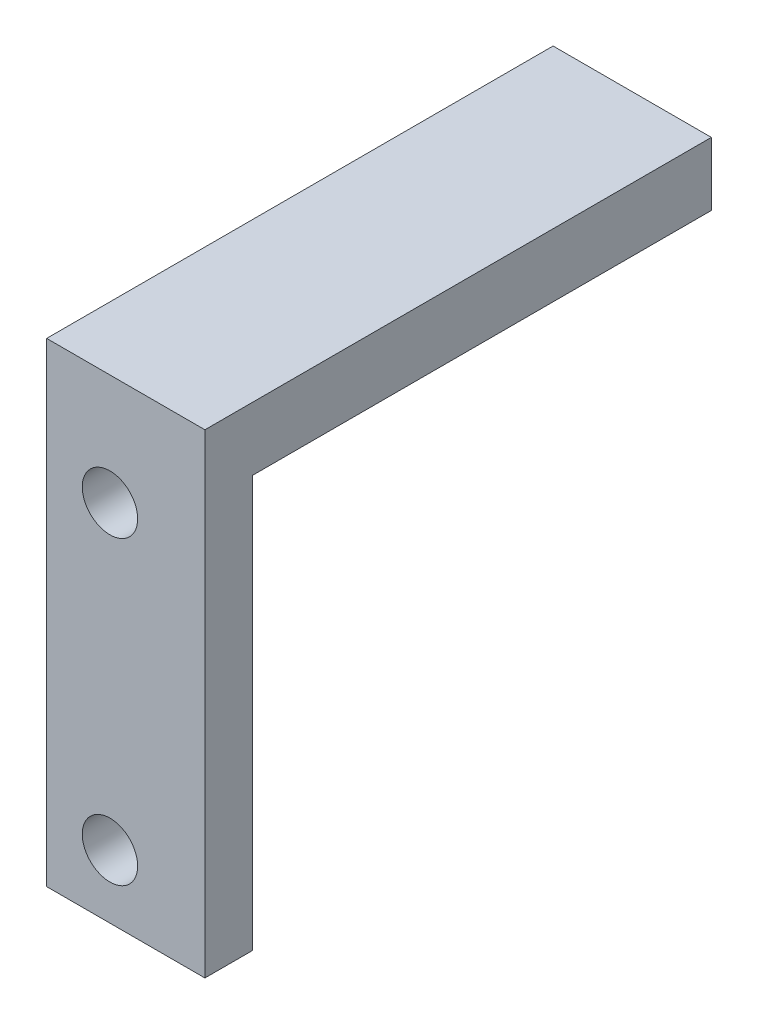
ISO-10303-21;
HEADER;
FILE_DESCRIPTION(('STEP AP214'),'2;1');
FILE_NAME('part.step','',(''),(''),'','','');
FILE_SCHEMA(('AUTOMOTIVE_DESIGN { 1 0 10303 214 1 1 1 1 }'));
ENDSEC;
DATA;
#1=APPLICATION_CONTEXT('core data for automotive mechanical design processes');
#2=APPLICATION_PROTOCOL_DEFINITION('international standard','automotive_design',2000,#1);
#3=PRODUCT_CONTEXT('',#1,'mechanical');
#4=PRODUCT('Part','Part','',(#3));
#5=PRODUCT_RELATED_PRODUCT_CATEGORY('part','',(#4));
#6=PRODUCT_DEFINITION_FORMATION('','',#4);
#7=PRODUCT_DEFINITION_CONTEXT('part definition',#1,'design');
#8=PRODUCT_DEFINITION('design','',#6,#7);
#9=PRODUCT_DEFINITION_SHAPE('','',#8);
#10=(LENGTH_UNIT() NAMED_UNIT(*) SI_UNIT(.MILLI.,.METRE.));
#11=(NAMED_UNIT(*) PLANE_ANGLE_UNIT() SI_UNIT($,.RADIAN.));
#12=(NAMED_UNIT(*) SI_UNIT($,.STERADIAN.) SOLID_ANGLE_UNIT());
#13=UNCERTAINTY_MEASURE_WITH_UNIT(LENGTH_MEASURE(1.E-05),#10,'distance_accuracy_value','');
#14=(GEOMETRIC_REPRESENTATION_CONTEXT(3) GLOBAL_UNCERTAINTY_ASSIGNED_CONTEXT((#13)) GLOBAL_UNIT_ASSIGNED_CONTEXT((#10,
#11,#12)) REPRESENTATION_CONTEXT('',''));
#15=CARTESIAN_POINT('',(0.,0.,0.));
#16=DIRECTION('',(0.,0.,1.));
#17=DIRECTION('',(1.,0.,0.));
#18=AXIS2_PLACEMENT_3D('',#15,#16,#17);
#19=CARTESIAN_POINT('',(0.,0.,32.));
#20=DIRECTION('',(0.,0.,1.));
#21=DIRECTION('',(1.,0.,0.));
#22=AXIS2_PLACEMENT_3D('',#19,#20,#21);
#23=PLANE('',#22);
#24=CARTESIAN_POINT('',(4.,-7.,32.));
#25=DIRECTION('',(0.,0.,1.));
#26=DIRECTION('',(1.,0.,0.));
#27=AXIS2_PLACEMENT_3D('',#24,#25,#26);
#28=CIRCLE('',#27,1.75);
#29=CARTESIAN_POINT('',(5.75,-7.,32.));
#30=VERTEX_POINT('',#29);
#31=EDGE_CURVE('E162',#30,#30,#28,.T.);
#32=ORIENTED_EDGE('',*,*,#31,.F.);
#33=EDGE_LOOP('',(#32));
#34=FACE_BOUND('',#33,.T.);
#35=DIRECTION('',(0.,-1.,0.));
#36=VECTOR('',#35,1.);
#37=CARTESIAN_POINT('',(0.,0.,32.));
#38=LINE('',#37,#36);
#39=CARTESIAN_POINT('',(0.,0.,32.));
#40=VERTEX_POINT('',#39);
#41=CARTESIAN_POINT('',(0.,-30.,32.));
#42=VERTEX_POINT('',#41);
#43=EDGE_CURVE('E175',#40,#42,#38,.T.);
#44=ORIENTED_EDGE('',*,*,#43,.T.);
#45=DIRECTION('',(1.,0.,0.));
#46=VECTOR('',#45,1.);
#47=CARTESIAN_POINT('',(0.,-30.,32.));
#48=LINE('',#47,#46);
#49=CARTESIAN_POINT('',(10.,-30.,32.));
#50=VERTEX_POINT('',#49);
#51=EDGE_CURVE('E89',#42,#50,#48,.T.);
#52=ORIENTED_EDGE('',*,*,#51,.T.);
#53=DIRECTION('',(0.,1.,0.));
#54=VECTOR('',#53,1.);
#55=CARTESIAN_POINT('',(10.,0.,32.));
#56=LINE('',#55,#54);
#57=CARTESIAN_POINT('',(10.,0.,32.));
#58=VERTEX_POINT('',#57);
#59=EDGE_CURVE('E180',#50,#58,#56,.T.);
#60=ORIENTED_EDGE('',*,*,#59,.T.);
#61=DIRECTION('',(-1.,0.,0.));
#62=VECTOR('',#61,1.);
#63=CARTESIAN_POINT('',(0.,0.,32.));
#64=LINE('',#63,#62);
#65=EDGE_CURVE('E67',#58,#40,#64,.T.);
#66=ORIENTED_EDGE('',*,*,#65,.T.);
#67=EDGE_LOOP('',(#44,#52,#60,#66));
#68=FACE_BOUND('',#67,.T.);
#69=CARTESIAN_POINT('',(4.,-26.,32.));
#70=DIRECTION('',(0.,0.,1.));
#71=DIRECTION('',(1.,0.,0.));
#72=AXIS2_PLACEMENT_3D('',#69,#70,#71);
#73=CIRCLE('',#72,1.75);
#74=CARTESIAN_POINT('',(5.75000000000001,-26.,32.));
#75=VERTEX_POINT('',#74);
#76=EDGE_CURVE('E165',#75,#75,#73,.T.);
#77=ORIENTED_EDGE('',*,*,#76,.F.);
#78=EDGE_LOOP('',(#77));
#79=FACE_BOUND('',#78,.T.);
#80=ADVANCED_FACE('F41',(#34,#68,#79),#23,.T.);
#81=CARTESIAN_POINT('',(0.,0.,0.));
#82=DIRECTION('',(0.,0.,1.));
#83=DIRECTION('',(1.,0.,0.));
#84=AXIS2_PLACEMENT_3D('',#81,#82,#83);
#85=PLANE('',#84);
#86=DIRECTION('',(0.,1.,0.));
#87=VECTOR('',#86,1.);
#88=CARTESIAN_POINT('',(10.,0.,0.));
#89=LINE('',#88,#87);
#90=CARTESIAN_POINT('',(10.,-4.,0.));
#91=VERTEX_POINT('',#90);
#92=CARTESIAN_POINT('',(10.,0.,0.));
#93=VERTEX_POINT('',#92);
#94=EDGE_CURVE('E169',#91,#93,#89,.T.);
#95=ORIENTED_EDGE('',*,*,#94,.F.);
#96=DIRECTION('',(1.,0.,0.));
#97=VECTOR('',#96,1.);
#98=CARTESIAN_POINT('',(10.,-4.,0.));
#99=LINE('',#98,#97);
#100=CARTESIAN_POINT('',(0.,-4.,0.));
#101=VERTEX_POINT('',#100);
#102=EDGE_CURVE('E58',#101,#91,#99,.T.);
#103=ORIENTED_EDGE('',*,*,#102,.F.);
#104=DIRECTION('',(0.,-1.,0.));
#105=VECTOR('',#104,1.);
#106=CARTESIAN_POINT('',(0.,0.,0.));
#107=LINE('',#106,#105);
#108=CARTESIAN_POINT('',(0.,0.,0.));
#109=VERTEX_POINT('',#108);
#110=EDGE_CURVE('E164',#109,#101,#107,.T.);
#111=ORIENTED_EDGE('',*,*,#110,.F.);
#112=DIRECTION('',(-1.,0.,0.));
#113=VECTOR('',#112,1.);
#114=CARTESIAN_POINT('',(0.,0.,0.));
#115=LINE('',#114,#113);
#116=EDGE_CURVE('E82',#93,#109,#115,.T.);
#117=ORIENTED_EDGE('',*,*,#116,.F.);
#118=EDGE_LOOP('',(#95,#103,#111,#117));
#119=FACE_BOUND('',#118,.T.);
#120=ADVANCED_FACE('F133',(#119),#85,.F.);
#121=CARTESIAN_POINT('',(0.,0.,32.));
#122=DIRECTION('',(1.,0.,0.));
#123=DIRECTION('',(0.,1.,0.));
#124=AXIS2_PLACEMENT_3D('',#121,#122,#123);
#125=PLANE('',#124);
#126=DIRECTION('',(0.,0.,-1.));
#127=VECTOR('',#126,1.);
#128=CARTESIAN_POINT('',(0.,-4.,59.8567765543682));
#129=LINE('',#128,#127);
#130=CARTESIAN_POINT('',(0.,-4.,29.));
#131=VERTEX_POINT('',#130);
#132=EDGE_CURVE('E120',#131,#101,#129,.T.);
#133=ORIENTED_EDGE('',*,*,#132,.F.);
#134=DIRECTION('',(0.,1.,0.));
#135=VECTOR('',#134,1.);
#136=CARTESIAN_POINT('',(0.,-30.,29.));
#137=LINE('',#136,#135);
#138=CARTESIAN_POINT('',(0.,-30.,29.));
#139=VERTEX_POINT('',#138);
#140=EDGE_CURVE('E109',#139,#131,#137,.T.);
#141=ORIENTED_EDGE('',*,*,#140,.F.);
#142=DIRECTION('',(0.,0.,-1.));
#143=VECTOR('',#142,1.);
#144=CARTESIAN_POINT('',(0.,-30.,32.));
#145=LINE('',#144,#143);
#146=EDGE_CURVE('E12',#42,#139,#145,.T.);
#147=ORIENTED_EDGE('',*,*,#146,.F.);
#148=ORIENTED_EDGE('',*,*,#43,.F.);
#149=DIRECTION('',(0.,0.,-1.));
#150=VECTOR('',#149,1.);
#151=CARTESIAN_POINT('',(0.,0.,32.));
#152=LINE('',#151,#150);
#153=EDGE_CURVE('E184',#40,#109,#152,.T.);
#154=ORIENTED_EDGE('',*,*,#153,.T.);
#155=ORIENTED_EDGE('',*,*,#110,.T.);
#156=EDGE_LOOP('',(#133,#141,#147,#148,#154,#155));
#157=FACE_BOUND('',#156,.T.);
#158=ADVANCED_FACE('F43',(#157),#125,.F.);
#159=CARTESIAN_POINT('',(0.,-30.,32.));
#160=DIRECTION('',(0.,1.,0.));
#161=DIRECTION('',(0.,0.,1.));
#162=AXIS2_PLACEMENT_3D('',#159,#160,#161);
#163=PLANE('',#162);
#164=ORIENTED_EDGE('',*,*,#146,.T.);
#165=DIRECTION('',(-1.,0.,0.));
#166=VECTOR('',#165,1.);
#167=CARTESIAN_POINT('',(10.,-30.,29.));
#168=LINE('',#167,#166);
#169=CARTESIAN_POINT('',(10.,-30.,29.));
#170=VERTEX_POINT('',#169);
#171=EDGE_CURVE('E105',#170,#139,#168,.T.);
#172=ORIENTED_EDGE('',*,*,#171,.F.);
#173=DIRECTION('',(0.,0.,-1.));
#174=VECTOR('',#173,1.);
#175=CARTESIAN_POINT('',(10.,-30.,32.));
#176=LINE('',#175,#174);
#177=EDGE_CURVE('E51',#50,#170,#176,.T.);
#178=ORIENTED_EDGE('',*,*,#177,.F.);
#179=ORIENTED_EDGE('',*,*,#51,.F.);
#180=EDGE_LOOP('',(#164,#172,#178,#179));
#181=FACE_BOUND('',#180,.T.);
#182=ADVANCED_FACE('F123',(#181),#163,.F.);
#183=CARTESIAN_POINT('',(10.,0.,32.));
#184=DIRECTION('',(-1.,0.,0.));
#185=DIRECTION('',(0.,-1.,0.));
#186=AXIS2_PLACEMENT_3D('',#183,#184,#185);
#187=PLANE('',#186);
#188=ORIENTED_EDGE('',*,*,#177,.T.);
#189=DIRECTION('',(0.,-1.,0.));
#190=VECTOR('',#189,1.);
#191=CARTESIAN_POINT('',(10.,-30.,29.));
#192=LINE('',#191,#190);
#193=CARTESIAN_POINT('',(10.,-4.,29.));
#194=VERTEX_POINT('',#193);
#195=EDGE_CURVE('E112',#194,#170,#192,.T.);
#196=ORIENTED_EDGE('',*,*,#195,.F.);
#197=DIRECTION('',(0.,0.,-1.));
#198=VECTOR('',#197,1.);
#199=CARTESIAN_POINT('',(10.,-4.,59.8567765543682));
#200=LINE('',#199,#198);
#201=EDGE_CURVE('E206',#194,#91,#200,.T.);
#202=ORIENTED_EDGE('',*,*,#201,.T.);
#203=ORIENTED_EDGE('',*,*,#94,.T.);
#204=DIRECTION('',(0.,0.,-1.));
#205=VECTOR('',#204,1.);
#206=CARTESIAN_POINT('',(10.,0.,32.));
#207=LINE('',#206,#205);
#208=EDGE_CURVE('E192',#58,#93,#207,.T.);
#209=ORIENTED_EDGE('',*,*,#208,.F.);
#210=ORIENTED_EDGE('',*,*,#59,.F.);
#211=EDGE_LOOP('',(#188,#196,#202,#203,#209,#210));
#212=FACE_BOUND('',#211,.T.);
#213=ADVANCED_FACE('F125',(#212),#187,.F.);
#214=CARTESIAN_POINT('',(0.,0.,32.));
#215=DIRECTION('',(0.,-1.,0.));
#216=DIRECTION('',(0.,0.,-1.));
#217=AXIS2_PLACEMENT_3D('',#214,#215,#216);
#218=PLANE('',#217);
#219=ORIENTED_EDGE('',*,*,#116,.T.);
#220=ORIENTED_EDGE('',*,*,#153,.F.);
#221=ORIENTED_EDGE('',*,*,#65,.F.);
#222=ORIENTED_EDGE('',*,*,#208,.T.);
#223=EDGE_LOOP('',(#219,#220,#221,#222));
#224=FACE_BOUND('',#223,.T.);
#225=ADVANCED_FACE('F130',(#224),#218,.F.);
#226=CARTESIAN_POINT('',(4.,-7.,32.));
#227=DIRECTION('',(0.,0.,-1.));
#228=DIRECTION('',(-1.,0.,0.));
#229=AXIS2_PLACEMENT_3D('',#226,#227,#228);
#230=CYLINDRICAL_SURFACE('',#229,1.75);
#231=CARTESIAN_POINT('',(4.,-7.,29.));
#232=DIRECTION('',(0.,0.,1.));
#233=DIRECTION('',(1.,0.,0.));
#234=AXIS2_PLACEMENT_3D('',#231,#232,#233);
#235=CIRCLE('',#234,1.75);
#236=CARTESIAN_POINT('',(5.75,-7.,29.));
#237=VERTEX_POINT('',#236);
#238=EDGE_CURVE('E160',#237,#237,#235,.T.);
#239=ORIENTED_EDGE('',*,*,#238,.F.);
#240=EDGE_LOOP('',(#239));
#241=FACE_BOUND('',#240,.T.);
#242=ORIENTED_EDGE('',*,*,#31,.T.);
#243=EDGE_LOOP('',(#242));
#244=FACE_BOUND('',#243,.T.);
#245=ADVANCED_FACE('F144',(#241,#244),#230,.F.);
#246=CARTESIAN_POINT('',(4.,-26.,32.));
#247=DIRECTION('',(0.,0.,-1.));
#248=DIRECTION('',(-1.,0.,0.));
#249=AXIS2_PLACEMENT_3D('',#246,#247,#248);
#250=CYLINDRICAL_SURFACE('',#249,1.75);
#251=CARTESIAN_POINT('',(4.,-26.,29.));
#252=DIRECTION('',(0.,0.,1.));
#253=DIRECTION('',(1.,0.,0.));
#254=AXIS2_PLACEMENT_3D('',#251,#252,#253);
#255=CIRCLE('',#254,1.75);
#256=CARTESIAN_POINT('',(5.75000000000001,-26.,29.));
#257=VERTEX_POINT('',#256);
#258=EDGE_CURVE('E45',#257,#257,#255,.T.);
#259=ORIENTED_EDGE('',*,*,#258,.F.);
#260=EDGE_LOOP('',(#259));
#261=FACE_BOUND('',#260,.T.);
#262=ORIENTED_EDGE('',*,*,#76,.T.);
#263=EDGE_LOOP('',(#262));
#264=FACE_BOUND('',#263,.T.);
#265=ADVANCED_FACE('F151',(#261,#264),#250,.F.);
#266=CARTESIAN_POINT('',(0.,0.,29.));
#267=DIRECTION('',(0.,0.,1.));
#268=DIRECTION('',(1.,0.,0.));
#269=AXIS2_PLACEMENT_3D('',#266,#267,#268);
#270=PLANE('',#269);
#271=ORIENTED_EDGE('',*,*,#238,.T.);
#272=EDGE_LOOP('',(#271));
#273=FACE_BOUND('',#272,.T.);
#274=ORIENTED_EDGE('',*,*,#258,.T.);
#275=EDGE_LOOP('',(#274));
#276=FACE_BOUND('',#275,.T.);
#277=ORIENTED_EDGE('',*,*,#195,.T.);
#278=ORIENTED_EDGE('',*,*,#171,.T.);
#279=ORIENTED_EDGE('',*,*,#140,.T.);
#280=DIRECTION('',(1.,0.,0.));
#281=VECTOR('',#280,1.);
#282=CARTESIAN_POINT('',(10.,-4.,29.));
#283=LINE('',#282,#281);
#284=EDGE_CURVE('E207',#131,#194,#283,.T.);
#285=ORIENTED_EDGE('',*,*,#284,.T.);
#286=EDGE_LOOP('',(#277,#278,#279,#285));
#287=FACE_BOUND('',#286,.T.);
#288=ADVANCED_FACE('F107',(#273,#276,#287),#270,.F.);
#289=CARTESIAN_POINT('',(10.,-4.,59.8567765543682));
#290=DIRECTION('',(0.,1.,0.));
#291=DIRECTION('',(0.,0.,1.));
#292=AXIS2_PLACEMENT_3D('',#289,#290,#291);
#293=PLANE('',#292);
#294=ORIENTED_EDGE('',*,*,#132,.T.);
#295=ORIENTED_EDGE('',*,*,#102,.T.);
#296=ORIENTED_EDGE('',*,*,#201,.F.);
#297=ORIENTED_EDGE('',*,*,#284,.F.);
#298=EDGE_LOOP('',(#294,#295,#296,#297));
#299=FACE_BOUND('',#298,.T.);
#300=ADVANCED_FACE('F222',(#299),#293,.F.);
#301=CLOSED_SHELL('',(#80,#120,#158,#182,#213,#225,#245,#265,#288,#300));
#302=MANIFOLD_SOLID_BREP('B2',#301);
#303=ADVANCED_BREP_SHAPE_REPRESENTATION('',(#18,#302),#14);
#304=SHAPE_DEFINITION_REPRESENTATION(#9,#303);
ENDSEC;
END-ISO-10303-21;
